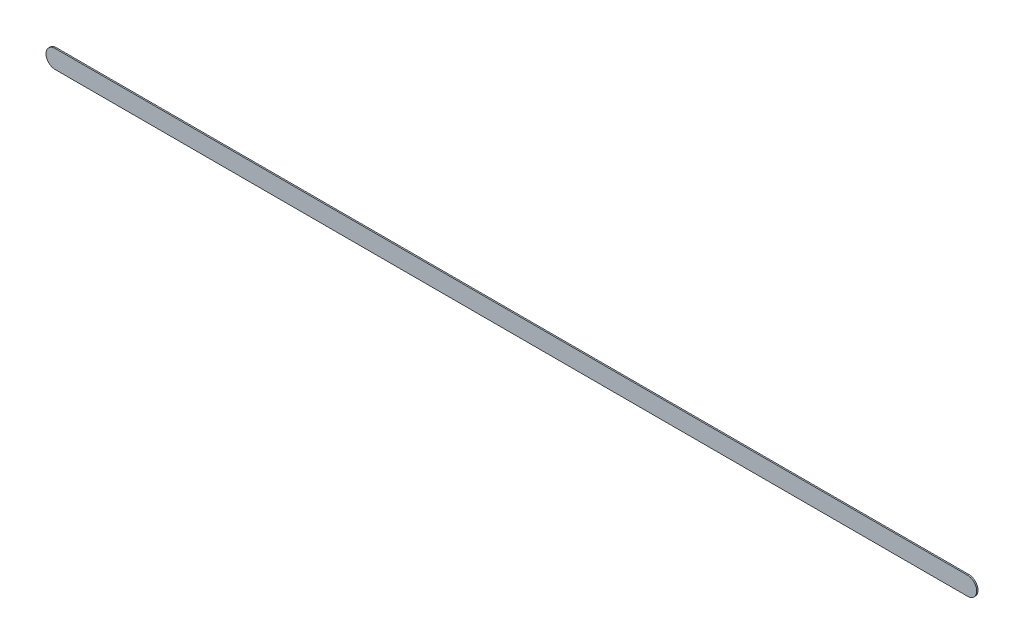
ISO-10303-21;
HEADER;
FILE_DESCRIPTION(('STEP AP214'),'2;1');
FILE_NAME('part.step','',(''),(''),'','','');
FILE_SCHEMA(('AUTOMOTIVE_DESIGN { 1 0 10303 214 1 1 1 1 }'));
ENDSEC;
DATA;
#1=APPLICATION_CONTEXT('core data for automotive mechanical design processes');
#2=APPLICATION_PROTOCOL_DEFINITION('international standard','automotive_design',2000,#1);
#3=PRODUCT_CONTEXT('',#1,'mechanical');
#4=PRODUCT('Part','Part','',(#3));
#5=PRODUCT_RELATED_PRODUCT_CATEGORY('part','',(#4));
#6=PRODUCT_DEFINITION_FORMATION('','',#4);
#7=PRODUCT_DEFINITION_CONTEXT('part definition',#1,'design');
#8=PRODUCT_DEFINITION('design','',#6,#7);
#9=PRODUCT_DEFINITION_SHAPE('','',#8);
#10=(LENGTH_UNIT() NAMED_UNIT(*) SI_UNIT(.MILLI.,.METRE.));
#11=(NAMED_UNIT(*) PLANE_ANGLE_UNIT() SI_UNIT($,.RADIAN.));
#12=(NAMED_UNIT(*) SI_UNIT($,.STERADIAN.) SOLID_ANGLE_UNIT());
#13=UNCERTAINTY_MEASURE_WITH_UNIT(LENGTH_MEASURE(1.E-05),#10,'distance_accuracy_value','');
#14=(GEOMETRIC_REPRESENTATION_CONTEXT(3) GLOBAL_UNCERTAINTY_ASSIGNED_CONTEXT((#13)) GLOBAL_UNIT_ASSIGNED_CONTEXT((#10,
#11,#12)) REPRESENTATION_CONTEXT('',''));
#15=CARTESIAN_POINT('',(0.,0.,0.));
#16=DIRECTION('',(0.,0.,1.));
#17=DIRECTION('',(1.,0.,0.));
#18=AXIS2_PLACEMENT_3D('',#15,#16,#17);
#19=CARTESIAN_POINT('',(63.8606292,73.6894005,0.));
#20=DIRECTION('',(0.,1.,0.));
#21=DIRECTION('',(1.,0.,0.));
#22=AXIS2_PLACEMENT_3D('',#19,#20,#21);
#23=PLANE('',#22);
#24=DIRECTION('',(1.,0.,0.));
#25=VECTOR('',#24,1.);
#26=CARTESIAN_POINT('',(63.8606292,73.6894005,0.03556));
#27=LINE('',#26,#25);
#28=CARTESIAN_POINT('',(63.8606292,73.6894005,0.03556));
#29=VERTEX_POINT('',#28);
#30=CARTESIAN_POINT('',(88.83940068,73.6894005,0.03556));
#31=VERTEX_POINT('',#30);
#32=EDGE_CURVE('E11',#29,#31,#27,.T.);
#33=ORIENTED_EDGE('',*,*,#32,.F.);
#34=DIRECTION('',(0.,0.,1.));
#35=VECTOR('',#34,1.);
#36=CARTESIAN_POINT('',(63.8606292,73.6894005,0.));
#37=LINE('',#36,#35);
#38=CARTESIAN_POINT('',(63.8606292,73.6894005,0.));
#39=VERTEX_POINT('',#38);
#40=EDGE_CURVE('E24',#39,#29,#37,.T.);
#41=ORIENTED_EDGE('',*,*,#40,.F.);
#42=DIRECTION('',(1.,0.,0.));
#43=VECTOR('',#42,1.);
#44=CARTESIAN_POINT('',(63.8606292,73.6894005,0.));
#45=LINE('',#44,#43);
#46=CARTESIAN_POINT('',(88.83940068,73.6894005,0.));
#47=VERTEX_POINT('',#46);
#48=EDGE_CURVE('E75',#39,#47,#45,.T.);
#49=ORIENTED_EDGE('',*,*,#48,.T.);
#50=DIRECTION('',(0.,0.,1.));
#51=VECTOR('',#50,1.);
#52=CARTESIAN_POINT('',(88.83940068,73.6894005,0.));
#53=LINE('',#52,#51);
#54=EDGE_CURVE('E37',#47,#31,#53,.T.);
#55=ORIENTED_EDGE('',*,*,#54,.T.);
#56=EDGE_LOOP('',(#33,#41,#49,#55));
#57=FACE_BOUND('',#56,.T.);
#58=ADVANCED_FACE('F17',(#57),#23,.F.);
#59=CARTESIAN_POINT('',(88.83940068,73.9394,0.));
#60=DIRECTION('',(0.,0.,-1.));
#61=DIRECTION('',(0.,-1.,0.));
#62=AXIS2_PLACEMENT_3D('',#59,#60,#61);
#63=CYLINDRICAL_SURFACE('',#62,0.249999499999997);
#64=CARTESIAN_POINT('',(88.83940068,73.9394,0.03556));
#65=DIRECTION('',(0.,0.,1.));
#66=DIRECTION('',(0.,-1.,0.));
#67=AXIS2_PLACEMENT_3D('',#64,#65,#66);
#68=CIRCLE('',#67,0.249999499999997);
#69=CARTESIAN_POINT('',(88.83940068,74.1893995,0.03556));
#70=VERTEX_POINT('',#69);
#71=EDGE_CURVE('E83',#31,#70,#68,.T.);
#72=ORIENTED_EDGE('',*,*,#71,.F.);
#73=ORIENTED_EDGE('',*,*,#54,.F.);
#74=CARTESIAN_POINT('',(88.83940068,73.9394,0.));
#75=DIRECTION('',(0.,0.,1.));
#76=DIRECTION('',(0.,-1.,0.));
#77=AXIS2_PLACEMENT_3D('',#74,#75,#76);
#78=CIRCLE('',#77,0.249999499999997);
#79=CARTESIAN_POINT('',(88.83940068,74.1893995,0.));
#80=VERTEX_POINT('',#79);
#81=EDGE_CURVE('E81',#47,#80,#78,.T.);
#82=ORIENTED_EDGE('',*,*,#81,.T.);
#83=DIRECTION('',(0.,0.,1.));
#84=VECTOR('',#83,1.);
#85=CARTESIAN_POINT('',(88.83940068,74.1893995,0.));
#86=LINE('',#85,#84);
#87=EDGE_CURVE('E67',#80,#70,#86,.T.);
#88=ORIENTED_EDGE('',*,*,#87,.T.);
#89=EDGE_LOOP('',(#72,#73,#82,#88));
#90=FACE_BOUND('',#89,.T.);
#91=ADVANCED_FACE('F89',(#90),#63,.T.);
#92=CARTESIAN_POINT('',(88.83940068,74.1893995,0.));
#93=DIRECTION('',(0.,-1.,0.));
#94=DIRECTION('',(-1.,0.,0.));
#95=AXIS2_PLACEMENT_3D('',#92,#93,#94);
#96=PLANE('',#95);
#97=DIRECTION('',(-1.,0.,0.));
#98=VECTOR('',#97,1.);
#99=CARTESIAN_POINT('',(88.83940068,74.1893995,0.03556));
#100=LINE('',#99,#98);
#101=CARTESIAN_POINT('',(63.8606292,74.1893995,0.03556));
#102=VERTEX_POINT('',#101);
#103=EDGE_CURVE('E71',#70,#102,#100,.T.);
#104=ORIENTED_EDGE('',*,*,#103,.F.);
#105=ORIENTED_EDGE('',*,*,#87,.F.);
#106=DIRECTION('',(-1.,0.,0.));
#107=VECTOR('',#106,1.);
#108=CARTESIAN_POINT('',(88.83940068,74.1893995,0.));
#109=LINE('',#108,#107);
#110=CARTESIAN_POINT('',(63.8606292,74.1893995,0.));
#111=VERTEX_POINT('',#110);
#112=EDGE_CURVE('E63',#80,#111,#109,.T.);
#113=ORIENTED_EDGE('',*,*,#112,.T.);
#114=DIRECTION('',(0.,0.,1.));
#115=VECTOR('',#114,1.);
#116=CARTESIAN_POINT('',(63.8606292,74.1893995,0.));
#117=LINE('',#116,#115);
#118=EDGE_CURVE('E53',#111,#102,#117,.T.);
#119=ORIENTED_EDGE('',*,*,#118,.T.);
#120=EDGE_LOOP('',(#104,#105,#113,#119));
#121=FACE_BOUND('',#120,.T.);
#122=ADVANCED_FACE('F66',(#121),#96,.F.);
#123=CARTESIAN_POINT('',(63.8606292,73.9394,0.));
#124=DIRECTION('',(0.,0.,-1.));
#125=DIRECTION('',(0.,1.,0.));
#126=AXIS2_PLACEMENT_3D('',#123,#124,#125);
#127=CYLINDRICAL_SURFACE('',#126,0.249999499999997);
#128=CARTESIAN_POINT('',(63.8606292,73.9394,0.03556));
#129=DIRECTION('',(0.,0.,1.));
#130=DIRECTION('',(0.,1.,0.));
#131=AXIS2_PLACEMENT_3D('',#128,#129,#130);
#132=CIRCLE('',#131,0.249999499999997);
#133=EDGE_CURVE('E59',#102,#29,#132,.T.);
#134=ORIENTED_EDGE('',*,*,#133,.F.);
#135=ORIENTED_EDGE('',*,*,#118,.F.);
#136=CARTESIAN_POINT('',(63.8606292,73.9394,0.));
#137=DIRECTION('',(0.,0.,1.));
#138=DIRECTION('',(0.,1.,0.));
#139=AXIS2_PLACEMENT_3D('',#136,#137,#138);
#140=CIRCLE('',#139,0.249999499999997);
#141=EDGE_CURVE('E57',#111,#39,#140,.T.);
#142=ORIENTED_EDGE('',*,*,#141,.T.);
#143=ORIENTED_EDGE('',*,*,#40,.T.);
#144=EDGE_LOOP('',(#134,#135,#142,#143));
#145=FACE_BOUND('',#144,.T.);
#146=ADVANCED_FACE('F55',(#145),#127,.T.);
#147=CARTESIAN_POINT('',(63.8606292,73.6894005,0.));
#148=DIRECTION('',(0.,0.,-1.));
#149=DIRECTION('',(-1.,0.,0.));
#150=AXIS2_PLACEMENT_3D('',#147,#148,#149);
#151=PLANE('',#150);
#152=ORIENTED_EDGE('',*,*,#141,.F.);
#153=ORIENTED_EDGE('',*,*,#112,.F.);
#154=ORIENTED_EDGE('',*,*,#81,.F.);
#155=ORIENTED_EDGE('',*,*,#48,.F.);
#156=EDGE_LOOP('',(#152,#153,#154,#155));
#157=FACE_BOUND('',#156,.T.);
#158=ADVANCED_FACE('F74',(#157),#151,.T.);
#159=CARTESIAN_POINT('',(63.8606292,73.6894005,0.03556));
#160=DIRECTION('',(0.,0.,-1.));
#161=DIRECTION('',(-1.,0.,0.));
#162=AXIS2_PLACEMENT_3D('',#159,#160,#161);
#163=PLANE('',#162);
#164=ORIENTED_EDGE('',*,*,#32,.T.);
#165=ORIENTED_EDGE('',*,*,#71,.T.);
#166=ORIENTED_EDGE('',*,*,#103,.T.);
#167=ORIENTED_EDGE('',*,*,#133,.T.);
#168=EDGE_LOOP('',(#164,#165,#166,#167));
#169=FACE_BOUND('',#168,.T.);
#170=ADVANCED_FACE('F91',(#169),#163,.F.);
#171=CLOSED_SHELL('',(#58,#91,#122,#146,#158,#170));
#172=MANIFOLD_SOLID_BREP('B1',#171);
#173=ADVANCED_BREP_SHAPE_REPRESENTATION('',(#18,#172),#14);
#174=SHAPE_DEFINITION_REPRESENTATION(#9,#173);
ENDSEC;
END-ISO-10303-21;
